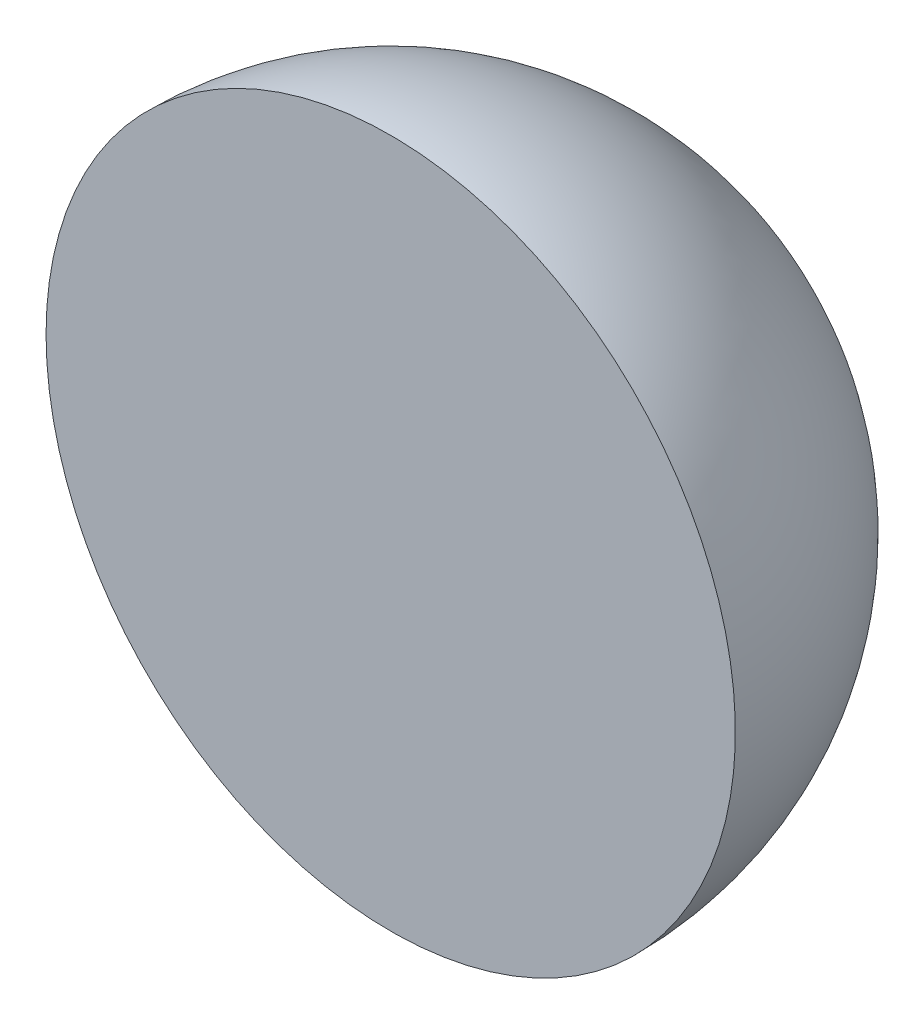
ISO-10303-21;
HEADER;
FILE_DESCRIPTION(('STEP AP214'),'2;1');
FILE_NAME('part.step','',(''),(''),'','','');
FILE_SCHEMA(('AUTOMOTIVE_DESIGN { 1 0 10303 214 1 1 1 1 }'));
ENDSEC;
DATA;
#1=APPLICATION_CONTEXT('core data for automotive mechanical design processes');
#2=APPLICATION_PROTOCOL_DEFINITION('international standard','automotive_design',2000,#1);
#3=PRODUCT_CONTEXT('',#1,'mechanical');
#4=PRODUCT('Part','Part','',(#3));
#5=PRODUCT_RELATED_PRODUCT_CATEGORY('part','',(#4));
#6=PRODUCT_DEFINITION_FORMATION('','',#4);
#7=PRODUCT_DEFINITION_CONTEXT('part definition',#1,'design');
#8=PRODUCT_DEFINITION('design','',#6,#7);
#9=PRODUCT_DEFINITION_SHAPE('','',#8);
#10=(LENGTH_UNIT() NAMED_UNIT(*) SI_UNIT(.MILLI.,.METRE.));
#11=(NAMED_UNIT(*) PLANE_ANGLE_UNIT() SI_UNIT($,.RADIAN.));
#12=(NAMED_UNIT(*) SI_UNIT($,.STERADIAN.) SOLID_ANGLE_UNIT());
#13=UNCERTAINTY_MEASURE_WITH_UNIT(LENGTH_MEASURE(1.E-05),#10,'distance_accuracy_value','');
#14=(GEOMETRIC_REPRESENTATION_CONTEXT(3) GLOBAL_UNCERTAINTY_ASSIGNED_CONTEXT((#13)) GLOBAL_UNIT_ASSIGNED_CONTEXT((#10,
#11,#12)) REPRESENTATION_CONTEXT('',''));
#15=CARTESIAN_POINT('',(0.,0.,0.));
#16=DIRECTION('',(0.,0.,1.));
#17=DIRECTION('',(1.,0.,0.));
#18=AXIS2_PLACEMENT_3D('',#15,#16,#17);
#19=CARTESIAN_POINT('',(0.,0.,-19.25));
#20=DIRECTION('',(0.,0.,-1.));
#21=DIRECTION('',(0.,-1.,0.));
#22=AXIS2_PLACEMENT_3D('',#19,#20,#21);
#23=PLANE('',#22);
#24=DIRECTION('',(0.,1.,0.));
#25=VECTOR('',#24,1.);
#26=CARTESIAN_POINT('',(-6.31080346845797,1.77001531095697,-19.25));
#27=LINE('',#26,#25);
#28=CARTESIAN_POINT('',(-6.31080346845797,1.77001531095697,-19.25));
#29=VERTEX_POINT('',#28);
#30=CARTESIAN_POINT('',(-6.31080346845797,1.94852340802144,-19.25));
#31=VERTEX_POINT('',#30);
#32=EDGE_CURVE('E132',#29,#31,#27,.T.);
#33=ORIENTED_EDGE('',*,*,#32,.T.);
#34=DIRECTION('',(1.,0.,0.));
#35=VECTOR('',#34,1.);
#36=CARTESIAN_POINT('',(-6.31080346845797,1.94852340802144,-19.25));
#37=LINE('',#36,#35);
#38=CARTESIAN_POINT('',(-5.82356018087552,1.94852340802144,-19.25));
#39=VERTEX_POINT('',#38);
#40=EDGE_CURVE('E11',#31,#39,#37,.T.);
#41=ORIENTED_EDGE('',*,*,#40,.T.);
#42=DIRECTION('',(0.,1.,0.));
#43=VECTOR('',#42,1.);
#44=CARTESIAN_POINT('',(-5.82356018087552,1.94852340802144,-19.25));
#45=LINE('',#44,#43);
#46=CARTESIAN_POINT('',(-5.82356018087552,2.43576669560388,-19.25));
#47=VERTEX_POINT('',#46);
#48=EDGE_CURVE('E158',#39,#47,#45,.T.);
#49=ORIENTED_EDGE('',*,*,#48,.T.);
#50=DIRECTION('',(1.,0.,0.));
#51=VECTOR('',#50,1.);
#52=CARTESIAN_POINT('',(-5.82356018087552,2.43576669560388,-19.25));
#53=LINE('',#52,#51);
#54=CARTESIAN_POINT('',(-5.64505208381105,2.43576669560388,-19.25));
#55=VERTEX_POINT('',#54);
#56=EDGE_CURVE('E188',#47,#55,#53,.T.);
#57=ORIENTED_EDGE('',*,*,#56,.T.);
#58=DIRECTION('',(0.,-1.,0.));
#59=VECTOR('',#58,1.);
#60=CARTESIAN_POINT('',(-5.64505208381105,2.43576669560388,-19.25));
#61=LINE('',#60,#59);
#62=CARTESIAN_POINT('',(-5.64505208381105,1.94852340802144,-19.25));
#63=VERTEX_POINT('',#62);
#64=EDGE_CURVE('E183',#55,#63,#61,.T.);
#65=ORIENTED_EDGE('',*,*,#64,.T.);
#66=DIRECTION('',(1.,0.,0.));
#67=VECTOR('',#66,1.);
#68=CARTESIAN_POINT('',(-5.64505208381105,1.94852340802144,-19.25));
#69=LINE('',#68,#67);
#70=CARTESIAN_POINT('',(-5.1578087962286,1.94852340802144,-19.25));
#71=VERTEX_POINT('',#70);
#72=EDGE_CURVE('E184',#63,#71,#69,.T.);
#73=ORIENTED_EDGE('',*,*,#72,.T.);
#74=DIRECTION('',(0.,-1.,0.));
#75=VECTOR('',#74,1.);
#76=CARTESIAN_POINT('',(-5.1578087962286,1.94852340802144,-19.25));
#77=LINE('',#76,#75);
#78=CARTESIAN_POINT('',(-5.1578087962286,1.77001531095697,-19.25));
#79=VERTEX_POINT('',#78);
#80=EDGE_CURVE('E205',#71,#79,#77,.T.);
#81=ORIENTED_EDGE('',*,*,#80,.T.);
#82=DIRECTION('',(-1.,0.,0.));
#83=VECTOR('',#82,1.);
#84=CARTESIAN_POINT('',(-5.1578087962286,1.77001531095697,-19.25));
#85=LINE('',#84,#83);
#86=CARTESIAN_POINT('',(-5.64505208381105,1.77001531095697,-19.25));
#87=VERTEX_POINT('',#86);
#88=EDGE_CURVE('E225',#79,#87,#85,.T.);
#89=ORIENTED_EDGE('',*,*,#88,.T.);
#90=DIRECTION('',(0.,-1.,0.));
#91=VECTOR('',#90,1.);
#92=CARTESIAN_POINT('',(-5.64505208381105,1.77001531095697,-19.25));
#93=LINE('',#92,#91);
#94=CARTESIAN_POINT('',(-5.64505208381105,1.28277202337452,-19.25));
#95=VERTEX_POINT('',#94);
#96=EDGE_CURVE('E164',#87,#95,#93,.T.);
#97=ORIENTED_EDGE('',*,*,#96,.T.);
#98=DIRECTION('',(-1.,0.,0.));
#99=VECTOR('',#98,1.);
#100=CARTESIAN_POINT('',(-5.64505208381105,1.28277202337452,-19.25));
#101=LINE('',#100,#99);
#102=CARTESIAN_POINT('',(-5.82356018087552,1.28277202337452,-19.25));
#103=VERTEX_POINT('',#102);
#104=EDGE_CURVE('E178',#95,#103,#101,.T.);
#105=ORIENTED_EDGE('',*,*,#104,.T.);
#106=DIRECTION('',(0.,1.,0.));
#107=VECTOR('',#106,1.);
#108=CARTESIAN_POINT('',(-5.82356018087552,1.28277202337452,-19.25));
#109=LINE('',#108,#107);
#110=CARTESIAN_POINT('',(-5.82356018087552,1.77001531095697,-19.25));
#111=VERTEX_POINT('',#110);
#112=EDGE_CURVE('E159',#103,#111,#109,.T.);
#113=ORIENTED_EDGE('',*,*,#112,.T.);
#114=DIRECTION('',(-1.,0.,0.));
#115=VECTOR('',#114,1.);
#116=CARTESIAN_POINT('',(-5.82356018087552,1.77001531095697,-19.25));
#117=LINE('',#116,#115);
#118=EDGE_CURVE('E135',#111,#29,#117,.T.);
#119=ORIENTED_EDGE('',*,*,#118,.T.);
#120=EDGE_LOOP('',(#33,#41,#49,#57,#65,#73,#81,#89,#97,#105,#113,#119));
#121=FACE_BOUND('',#120,.T.);
#122=ADVANCED_FACE('F17',(#121),#23,.T.);
#123=CARTESIAN_POINT('',(0.,1.94852340802144,-19.25));
#124=DIRECTION('',(0.,0.996194698091746,0.0871557427476584));
#125=DIRECTION('',(1.,0.,0.));
#126=AXIS2_PLACEMENT_3D('',#123,#124,#125);
#127=PLANE('',#126);
#128=CARTESIAN_POINT('',(-5.73872876766255,1.93091904260248,-19.0487811825043));
#129=DIRECTION('',(0.,0.996194698091746,0.0871557427476583));
#130=DIRECTION('',(0.,0.0871557427476583,-0.996194698091746));
#131=AXIS2_PLACEMENT_3D('',#128,#129,#130);
#132=CIRCLE('',#131,1.30146994110697);
#133=CARTESIAN_POINT('',(-5.91830148295344,2.04326471009936,-20.3328980379823));
#134=VERTEX_POINT('',#133);
#135=CARTESIAN_POINT('',(-6.3913383554165,2.02905829497997,-20.170517970133));
#136=VERTEX_POINT('',#135);
#137=EDGE_CURVE('E150',#134,#136,#132,.T.);
#138=ORIENTED_EDGE('',*,*,#137,.F.);
#139=DIRECTION('',(0.0868265938642483,-0.0868265938642478,0.992432509138967));
#140=VECTOR('',#139,1.);
#141=CARTESIAN_POINT('',(-5.91830148295344,2.04326471009936,-20.3328980379823));
#142=LINE('',#141,#140);
#143=EDGE_CURVE('E28',#134,#39,#142,.T.);
#144=ORIENTED_EDGE('',*,*,#143,.T.);
#145=ORIENTED_EDGE('',*,*,#40,.F.);
#146=DIRECTION('',(0.0868265938642469,-0.0868265938642481,0.992432509138967));
#147=VECTOR('',#146,1.);
#148=CARTESIAN_POINT('',(-6.39133835541649,2.02905829497997,-20.170517970133));
#149=LINE('',#148,#147);
#150=EDGE_CURVE('E128',#136,#31,#149,.T.);
#151=ORIENTED_EDGE('',*,*,#150,.F.);
#152=EDGE_LOOP('',(#138,#144,#145,#151));
#153=FACE_BOUND('',#152,.T.);
#154=ADVANCED_FACE('F19',(#153),#127,.F.);
#155=CARTESIAN_POINT('',(-5.82356018087552,0.,-19.25));
#156=DIRECTION('',(-0.996194698091746,0.,0.0871557427476584));
#157=DIRECTION('',(0.,1.,0.));
#158=AXIS2_PLACEMENT_3D('',#155,#156,#157);
#159=PLANE('',#158);
#160=CARTESIAN_POINT('',(-5.8055509732179,1.91698789487955,-19.0441538145421));
#161=DIRECTION('',(-0.996194698091746,0.,0.0871557427476583));
#162=DIRECTION('',(-0.0871557427476583,0.,-0.996194698091746));
#163=AXIS2_PLACEMENT_3D('',#160,#161,#162);
#164=CIRCLE('',#163,1.29981544265263);
#165=CARTESIAN_POINT('',(-5.90599082530647,2.51819734003483,-20.192186577196));
#166=VERTEX_POINT('',#165);
#167=EDGE_CURVE('E173',#166,#134,#164,.T.);
#168=ORIENTED_EDGE('',*,*,#167,.F.);
#169=DIRECTION('',(0.0868265938642478,-0.086826593864248,0.992432509138967));
#170=VECTOR('',#169,1.);
#171=CARTESIAN_POINT('',(-5.90599082530647,2.51819734003483,-20.192186577196));
#172=LINE('',#171,#170);
#173=EDGE_CURVE('E191',#166,#47,#172,.T.);
#174=ORIENTED_EDGE('',*,*,#173,.T.);
#175=ORIENTED_EDGE('',*,*,#48,.F.);
#176=ORIENTED_EDGE('',*,*,#143,.F.);
#177=EDGE_LOOP('',(#168,#174,#175,#176));
#178=FACE_BOUND('',#177,.T.);
#179=ADVANCED_FACE('F299',(#178),#159,.F.);
#180=CARTESIAN_POINT('',(0.,2.43576669560388,-19.25));
#181=DIRECTION('',(0.,0.996194698091746,0.0871557427476584));
#182=DIRECTION('',(1.,0.,0.));
#183=AXIS2_PLACEMENT_3D('',#180,#181,#182);
#184=PLANE('',#183);
#185=CARTESIAN_POINT('',(-5.73872876766255,2.41446117000087,-19.0064767280198));
#186=DIRECTION('',(0.,0.996194698091746,0.0871557427476584));
#187=DIRECTION('',(0.,0.0871557427476584,-0.996194698091746));
#188=AXIS2_PLACEMENT_3D('',#185,#186,#187);
#189=CIRCLE('',#188,1.20193412270979);
#190=CARTESIAN_POINT('',(-5.56273128143256,2.51808749798237,-20.1909310767914));
#191=VERTEX_POINT('',#190);
#192=EDGE_CURVE('E169',#191,#166,#189,.T.);
#193=ORIENTED_EDGE('',*,*,#192,.F.);
#194=DIRECTION('',(-0.0868265938642477,-0.086826593864248,0.992432509138967));
#195=VECTOR('',#194,1.);
#196=CARTESIAN_POINT('',(-5.56273128143256,2.51808749798237,-20.1909310767914));
#197=LINE('',#196,#195);
#198=EDGE_CURVE('E192',#191,#55,#197,.T.);
#199=ORIENTED_EDGE('',*,*,#198,.T.);
#200=ORIENTED_EDGE('',*,*,#56,.F.);
#201=ORIENTED_EDGE('',*,*,#173,.F.);
#202=EDGE_LOOP('',(#193,#199,#200,#201));
#203=FACE_BOUND('',#202,.T.);
#204=ADVANCED_FACE('F297',(#203),#184,.F.);
#205=CARTESIAN_POINT('',(-5.64505208381105,0.,-19.25));
#206=DIRECTION('',(0.996194698091746,0.,0.0871557427476584));
#207=DIRECTION('',(0.,-1.,0.));
#208=AXIS2_PLACEMENT_3D('',#205,#206,#207);
#209=PLANE('',#208);
#210=CARTESIAN_POINT('',(-5.66312848123678,1.91698789487955,-19.0433858319784));
#211=DIRECTION('',(0.996194698091746,0.,0.0871557427476584));
#212=DIRECTION('',(-0.0871557427476584,0.,0.996194698091746));
#213=AXIS2_PLACEMENT_3D('',#210,#211,#212);
#214=CIRCLE('',#213,1.29933075830278);
#215=CARTESIAN_POINT('',(-5.55041949059348,2.04315600123901,-20.3316554900227));
#216=VERTEX_POINT('',#215);
#217=EDGE_CURVE('E174',#216,#191,#214,.T.);
#218=ORIENTED_EDGE('',*,*,#217,.F.);
#219=DIRECTION('',(-0.0868265938642481,-0.0868265938642476,0.992432509138967));
#220=VECTOR('',#219,1.);
#221=CARTESIAN_POINT('',(-5.55041949059348,2.043156001239,-20.3316554900227));
#222=LINE('',#221,#220);
#223=EDGE_CURVE('E179',#216,#63,#222,.T.);
#224=ORIENTED_EDGE('',*,*,#223,.T.);
#225=ORIENTED_EDGE('',*,*,#64,.F.);
#226=ORIENTED_EDGE('',*,*,#198,.F.);
#227=EDGE_LOOP('',(#218,#224,#225,#226));
#228=FACE_BOUND('',#227,.T.);
#229=ADVANCED_FACE('F304',(#228),#209,.F.);
#230=CARTESIAN_POINT('',(0.,1.94852340802144,-19.25));
#231=DIRECTION('',(0.,0.996194698091746,0.0871557427476584));
#232=DIRECTION('',(1.,0.,0.));
#233=AXIS2_PLACEMENT_3D('',#230,#231,#232);
#234=PLANE('',#233);
#235=CARTESIAN_POINT('',(-5.73872876766255,1.93091904260248,-19.0487811825043));
#236=DIRECTION('',(0.,0.996194698091746,0.0871557427476583));
#237=DIRECTION('',(0.,0.0871557427476583,-0.996194698091746));
#238=AXIS2_PLACEMENT_3D('',#235,#236,#237);
#239=CIRCLE('',#238,1.30146994110697);
#240=CARTESIAN_POINT('',(-5.07770272739347,2.02862947685657,-20.1656165565542));
#241=VERTEX_POINT('',#240);
#242=EDGE_CURVE('E236',#241,#216,#239,.T.);
#243=ORIENTED_EDGE('',*,*,#242,.F.);
#244=DIRECTION('',(-0.0868265938642468,-0.0868265938642474,0.992432509138967));
#245=VECTOR('',#244,1.);
#246=CARTESIAN_POINT('',(-5.07770272739346,2.02862947685657,-20.1656165565542));
#247=LINE('',#246,#245);
#248=EDGE_CURVE('E208',#241,#71,#247,.T.);
#249=ORIENTED_EDGE('',*,*,#248,.T.);
#250=ORIENTED_EDGE('',*,*,#72,.F.);
#251=ORIENTED_EDGE('',*,*,#223,.F.);
#252=EDGE_LOOP('',(#243,#249,#250,#251));
#253=FACE_BOUND('',#252,.T.);
#254=ADVANCED_FACE('F309',(#253),#234,.F.);
#255=CARTESIAN_POINT('',(-5.15780879622859,0.,-19.25));
#256=DIRECTION('',(0.996194698091746,0.,0.0871557427476584));
#257=DIRECTION('',(0.,-1.,0.));
#258=AXIS2_PLACEMENT_3D('',#255,#256,#257);
#259=PLANE('',#258);
#260=CARTESIAN_POINT('',(-5.17958635383838,1.91698789487955,-19.0010813774939));
#261=DIRECTION('',(0.996194698091746,0.,0.0871557427476584));
#262=DIRECTION('',(-0.0871557427476584,0.,0.996194698091746));
#263=AXIS2_PLACEMENT_3D('',#260,#261,#262);
#264=CIRCLE('',#263,1.17430247357013);
#265=CARTESIAN_POINT('',(-5.07914621126165,1.69135272599002,-20.1491174604426));
#266=VERTEX_POINT('',#265);
#267=EDGE_CURVE('E232',#266,#241,#264,.T.);
#268=ORIENTED_EDGE('',*,*,#267,.F.);
#269=DIRECTION('',(-0.086826593864248,0.086826593864248,0.992432509138967));
#270=VECTOR('',#269,1.);
#271=CARTESIAN_POINT('',(-5.07914621126165,1.69135272599002,-20.1491174604426));
#272=LINE('',#271,#270);
#273=EDGE_CURVE('E209',#266,#79,#272,.T.);
#274=ORIENTED_EDGE('',*,*,#273,.T.);
#275=ORIENTED_EDGE('',*,*,#80,.F.);
#276=ORIENTED_EDGE('',*,*,#248,.F.);
#277=EDGE_LOOP('',(#268,#274,#275,#276));
#278=FACE_BOUND('',#277,.T.);
#279=ADVANCED_FACE('F312',(#278),#259,.F.);
#280=CARTESIAN_POINT('',(0.,1.77001531095697,-19.25));
#281=DIRECTION('',(0.,-0.996194698091746,0.0871557427476584));
#282=DIRECTION('',(-1.,0.,0.));
#283=AXIS2_PLACEMENT_3D('',#280,#281,#282);
#284=PLANE('',#283);
#285=CARTESIAN_POINT('',(-5.73872876766255,1.78849655062135,-19.0387584640162));
#286=DIRECTION('',(0.,-0.996194698091746,0.0871557427476584));
#287=DIRECTION('',(0.,0.0871557427476585,0.996194698091746));
#288=AXIS2_PLACEMENT_3D('',#285,#286,#287);
#289=CIRCLE('',#288,1.29513828308694);
#290=CARTESIAN_POINT('',(-5.55183602933311,1.67679925647903,-20.3154643781399));
#291=VERTEX_POINT('',#290);
#292=EDGE_CURVE('E237',#291,#266,#289,.T.);
#293=ORIENTED_EDGE('',*,*,#292,.F.);
#294=DIRECTION('',(-0.0868265938642473,0.0868265938642481,0.992432509138967));
#295=VECTOR('',#294,1.);
#296=CARTESIAN_POINT('',(-5.55183602933311,1.67679925647903,-20.3154643781399));
#297=LINE('',#296,#295);
#298=EDGE_CURVE('E166',#291,#87,#297,.T.);
#299=ORIENTED_EDGE('',*,*,#298,.T.);
#300=ORIENTED_EDGE('',*,*,#88,.F.);
#301=ORIENTED_EDGE('',*,*,#273,.F.);
#302=EDGE_LOOP('',(#293,#299,#300,#301));
#303=FACE_BOUND('',#302,.T.);
#304=ADVANCED_FACE('F313',(#303),#284,.F.);
#305=CARTESIAN_POINT('',(-5.64505208381105,0.,-19.25));
#306=DIRECTION('',(0.996194698091746,0.,0.0871557427476584));
#307=DIRECTION('',(0.,-1.,0.));
#308=AXIS2_PLACEMENT_3D('',#305,#306,#307);
#309=PLANE('',#308);
#310=CARTESIAN_POINT('',(-5.66312848123678,1.91698789487955,-19.0433858319784));
#311=DIRECTION('',(0.996194698091746,0.,0.0871557427476584));
#312=DIRECTION('',(-0.0871557427476584,0.,0.996194698091746));
#313=AXIS2_PLACEMENT_3D('',#310,#311,#312);
#314=CIRCLE('',#313,1.29933075830278);
#315=CARTESIAN_POINT('',(-5.56833921807431,1.20605915763779,-20.1268320676656));
#316=VERTEX_POINT('',#315);
#317=EDGE_CURVE('E21',#316,#291,#314,.T.);
#318=ORIENTED_EDGE('',*,*,#317,.F.);
#319=DIRECTION('',(-0.0868265938642486,0.0868265938642479,0.992432509138967));
#320=VECTOR('',#319,1.);
#321=CARTESIAN_POINT('',(-5.56833921807432,1.20605915763779,-20.1268320676656));
#322=LINE('',#321,#320);
#323=EDGE_CURVE('E167',#316,#95,#322,.T.);
#324=ORIENTED_EDGE('',*,*,#323,.T.);
#325=ORIENTED_EDGE('',*,*,#96,.F.);
#326=ORIENTED_EDGE('',*,*,#298,.F.);
#327=EDGE_LOOP('',(#318,#324,#325,#326));
#328=FACE_BOUND('',#327,.T.);
#329=ADVANCED_FACE('F316',(#328),#309,.F.);
#330=CARTESIAN_POINT('',(0.,1.28277202337452,-19.25));
#331=DIRECTION('',(0.,-0.996194698091746,0.0871557427476584));
#332=DIRECTION('',(-1.,0.,0.));
#333=AXIS2_PLACEMENT_3D('',#330,#331,#332);
#334=PLANE('',#333);
#335=CARTESIAN_POINT('',(-5.73872876766255,1.30495442322296,-18.9964540095316));
#336=DIRECTION('',(0.,-0.996194698091746,0.0871557427476584));
#337=DIRECTION('',(0.,0.0871557427476584,0.996194698091746));
#338=AXIS2_PLACEMENT_3D('',#335,#336,#337);
#339=CIRCLE('',#338,1.14741772100429);
#340=CARTESIAN_POINT('',(-5.90038436075063,1.20594784349941,-20.1281043940893));
#341=VERTEX_POINT('',#340);
#342=EDGE_CURVE('E210',#341,#316,#339,.T.);
#343=ORIENTED_EDGE('',*,*,#342,.F.);
#344=DIRECTION('',(0.0868265938642484,0.0868265938642478,0.992432509138967));
#345=VECTOR('',#344,1.);
#346=CARTESIAN_POINT('',(-5.90038436075063,1.20594784349941,-20.1281043940893));
#347=LINE('',#346,#345);
#348=EDGE_CURVE('E162',#341,#103,#347,.T.);
#349=ORIENTED_EDGE('',*,*,#348,.T.);
#350=ORIENTED_EDGE('',*,*,#104,.F.);
#351=ORIENTED_EDGE('',*,*,#323,.F.);
#352=EDGE_LOOP('',(#343,#349,#350,#351));
#353=FACE_BOUND('',#352,.T.);
#354=ADVANCED_FACE('F323',(#353),#334,.F.);
#355=CARTESIAN_POINT('',(-5.82356018087552,0.,-19.25));
#356=DIRECTION('',(-0.996194698091746,0.,0.0871557427476584));
#357=DIRECTION('',(0.,1.,0.));
#358=AXIS2_PLACEMENT_3D('',#355,#356,#357);
#359=PLANE('',#358);
#360=CARTESIAN_POINT('',(-5.8055509732179,1.91698789487955,-19.0441538145421));
#361=DIRECTION('',(-0.996194698091746,0.,0.0871557427476583));
#362=DIRECTION('',(-0.0871557427476583,0.,-0.996194698091746));
#363=AXIS2_PLACEMENT_3D('',#360,#361,#362);
#364=CIRCLE('',#363,1.29981544265263);
#365=CARTESIAN_POINT('',(-5.91688463190261,1.67669085992988,-20.3167033563661));
#366=VERTEX_POINT('',#365);
#367=EDGE_CURVE('E214',#366,#341,#364,.T.);
#368=ORIENTED_EDGE('',*,*,#367,.F.);
#369=DIRECTION('',(0.0868265938642473,0.0868265938642479,0.992432509138967));
#370=VECTOR('',#369,1.);
#371=CARTESIAN_POINT('',(-5.9168846319026,1.67669085992988,-20.3167033563661));
#372=LINE('',#371,#370);
#373=EDGE_CURVE('E163',#366,#111,#372,.T.);
#374=ORIENTED_EDGE('',*,*,#373,.T.);
#375=ORIENTED_EDGE('',*,*,#112,.F.);
#376=ORIENTED_EDGE('',*,*,#348,.F.);
#377=EDGE_LOOP('',(#368,#374,#375,#376));
#378=FACE_BOUND('',#377,.T.);
#379=ADVANCED_FACE('F338',(#378),#359,.F.);
#380=CARTESIAN_POINT('',(0.,1.77001531095697,-19.25));
#381=DIRECTION('',(0.,-0.996194698091746,0.0871557427476584));
#382=DIRECTION('',(-1.,0.,0.));
#383=AXIS2_PLACEMENT_3D('',#380,#381,#382);
#384=PLANE('',#383);
#385=CARTESIAN_POINT('',(-5.73872876766255,1.78849655062135,-19.0387584640162));
#386=DIRECTION('',(0.,-0.996194698091746,0.0871557427476584));
#387=DIRECTION('',(0.,0.0871557427476585,0.996194698091746));
#388=AXIS2_PLACEMENT_3D('',#385,#386,#387);
#389=CIRCLE('',#388,1.29513828308694);
#390=CARTESIAN_POINT('',(-6.38989634138325,1.69092243803168,-20.1540356743117));
#391=VERTEX_POINT('',#390);
#392=EDGE_CURVE('E154',#391,#366,#389,.T.);
#393=ORIENTED_EDGE('',*,*,#392,.F.);
#394=DIRECTION('',(0.0868265938642476,0.0868265938642476,0.992432509138967));
#395=VECTOR('',#394,1.);
#396=CARTESIAN_POINT('',(-6.38989634138325,1.69092243803168,-20.1540356743117));
#397=LINE('',#396,#395);
#398=EDGE_CURVE('E139',#391,#29,#397,.T.);
#399=ORIENTED_EDGE('',*,*,#398,.T.);
#400=ORIENTED_EDGE('',*,*,#118,.F.);
#401=ORIENTED_EDGE('',*,*,#373,.F.);
#402=EDGE_LOOP('',(#393,#399,#400,#401));
#403=FACE_BOUND('',#402,.T.);
#404=ADVANCED_FACE('F277',(#403),#384,.F.);
#405=CARTESIAN_POINT('',(-6.31080346845797,0.,-19.25));
#406=DIRECTION('',(-0.996194698091746,0.,0.0871557427476584));
#407=DIRECTION('',(0.,1.,0.));
#408=AXIS2_PLACEMENT_3D('',#405,#406,#407);
#409=PLANE('',#408);
#410=CARTESIAN_POINT('',(-6.2890931006163,1.91698789487955,-19.0018493600575));
#411=DIRECTION('',(-0.996194698091746,0.,0.0871557427476584));
#412=DIRECTION('',(-0.0871557427476585,0.,-0.996194698091746));
#413=AXIS2_PLACEMENT_3D('',#410,#411,#412);
#414=CIRCLE('',#413,1.17847366830297);
#415=CARTESIAN_POINT('',(-6.3918038484858,1.91698789487955,-20.1758385802616));
#416=VERTEX_POINT('',#415);
#417=EDGE_CURVE('E142',#136,#416,#414,.T.);
#418=ORIENTED_EDGE('',*,*,#417,.F.);
#419=ORIENTED_EDGE('',*,*,#150,.T.);
#420=ORIENTED_EDGE('',*,*,#32,.F.);
#421=ORIENTED_EDGE('',*,*,#398,.F.);
#422=CARTESIAN_POINT('',(-6.2890931006163,1.91698789487955,-19.0018493600575));
#423=DIRECTION('',(-0.996194698091746,0.,0.0871557427476584));
#424=DIRECTION('',(-0.0871557427476585,0.,-0.996194698091746));
#425=AXIS2_PLACEMENT_3D('',#422,#423,#424);
#426=CIRCLE('',#425,1.17847366830297);
#427=EDGE_CURVE('E245',#416,#391,#426,.T.);
#428=ORIENTED_EDGE('',*,*,#427,.F.);
#429=EDGE_LOOP('',(#418,#419,#420,#421,#428));
#430=FACE_BOUND('',#429,.T.);
#431=ADVANCED_FACE('F140',(#430),#409,.F.);
#432=CARTESIAN_POINT('',(0.,3.8339757897591,-19.05));
#433=DIRECTION('',(0.,0.,1.));
#434=DIRECTION('',(0.,-1.,0.));
#435=AXIS2_PLACEMENT_3D('',#432,#433,#434);
#436=PLANE('',#435);
#437=CARTESIAN_POINT('',(-5.73872876766255,1.91698789487955,-19.05));
#438=DIRECTION('',(0.,0.,-1.));
#439=DIRECTION('',(1.,0.,0.));
#440=AXIS2_PLACEMENT_3D('',#437,#438,#439);
#441=CIRCLE('',#440,1.30154507029067);
#442=CARTESIAN_POINT('',(-7.04027383795322,1.91698789487955,-19.05));
#443=VERTEX_POINT('',#442);
#444=EDGE_CURVE('E197',#443,#443,#441,.T.);
#445=ORIENTED_EDGE('',*,*,#444,.F.);
#446=EDGE_LOOP('',(#445));
#447=FACE_BOUND('',#446,.T.);
#448=ADVANCED_FACE('F340',(#447),#436,.T.);
#449=CARTESIAN_POINT('',(-5.73872876766255,1.91698789487955,-19.05));
#450=DIRECTION('',(0.,0.,1.));
#451=DIRECTION('',(1.,0.,0.));
#452=AXIS2_PLACEMENT_3D('',#449,#450,#451);
#453=SPHERICAL_SURFACE('',#452,1.30154507029067);
#454=ORIENTED_EDGE('',*,*,#444,.T.);
#455=CARTESIAN_POINT('',(-5.73872876766255,1.91698789487955,-19.05));
#456=DIRECTION('',(0.,-1.,0.));
#457=DIRECTION('',(-1.,0.,0.));
#458=AXIS2_PLACEMENT_3D('',#455,#456,#457);
#459=CIRCLE('',#458,1.30154507029067);
#460=EDGE_CURVE('E201',#443,#416,#459,.T.);
#461=ORIENTED_EDGE('',*,*,#460,.T.);
#462=ORIENTED_EDGE('',*,*,#427,.T.);
#463=ORIENTED_EDGE('',*,*,#392,.T.);
#464=ORIENTED_EDGE('',*,*,#367,.T.);
#465=ORIENTED_EDGE('',*,*,#342,.T.);
#466=ORIENTED_EDGE('',*,*,#317,.T.);
#467=ORIENTED_EDGE('',*,*,#292,.T.);
#468=ORIENTED_EDGE('',*,*,#267,.T.);
#469=ORIENTED_EDGE('',*,*,#242,.T.);
#470=ORIENTED_EDGE('',*,*,#217,.T.);
#471=ORIENTED_EDGE('',*,*,#192,.T.);
#472=ORIENTED_EDGE('',*,*,#167,.T.);
#473=ORIENTED_EDGE('',*,*,#137,.T.);
#474=ORIENTED_EDGE('',*,*,#417,.T.);
#475=ORIENTED_EDGE('',*,*,#460,.F.);
#476=EDGE_LOOP('',(#454,#461,#462,#463,#464,#465,#466,#467,#468,#469,#470,#471,#472,#473,#474,#475));
#477=FACE_BOUND('',#476,.T.);
#478=ADVANCED_FACE('F281',(#477),#453,.T.);
#479=CLOSED_SHELL('',(#122,#154,#179,#204,#229,#254,#279,#304,#329,#354,#379,#404,#431,#448,#478));
#480=MANIFOLD_SOLID_BREP('B1',#479);
#481=ADVANCED_BREP_SHAPE_REPRESENTATION('',(#18,#480),#14);
#482=SHAPE_DEFINITION_REPRESENTATION(#9,#481);
ENDSEC;
END-ISO-10303-21;
